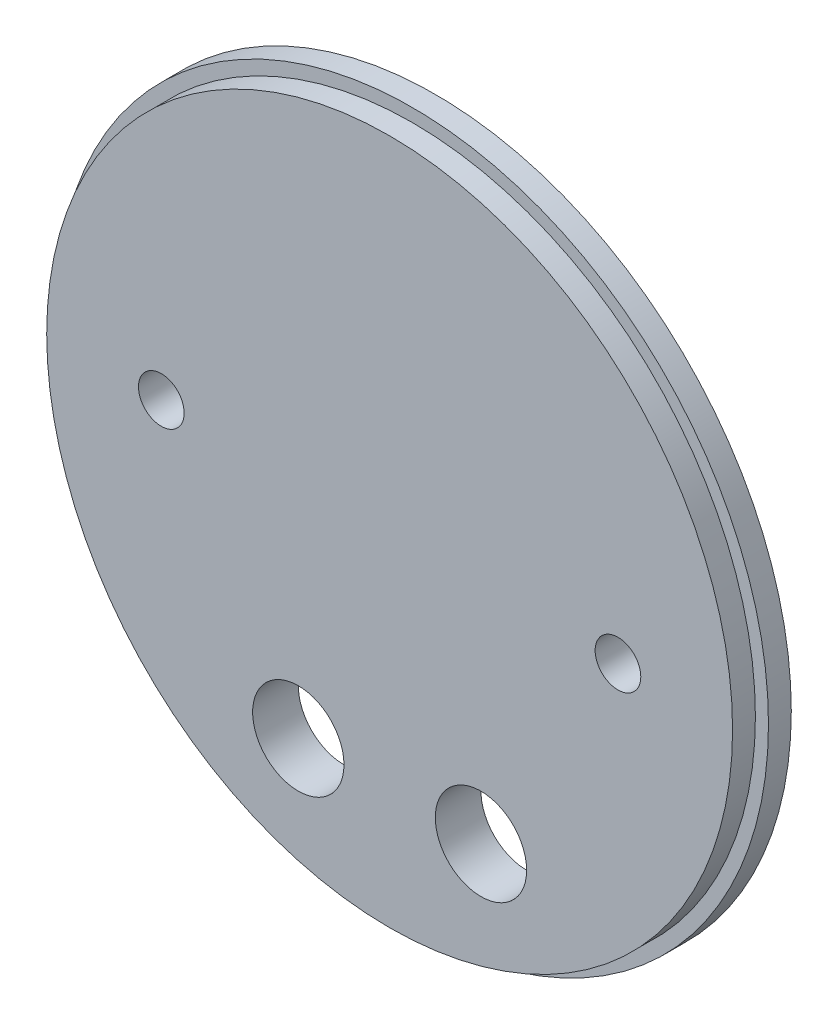
ISO-10303-21;
HEADER;
FILE_DESCRIPTION(('STEP AP214'),'2;1');
FILE_NAME('part.step','',(''),(''),'','','');
FILE_SCHEMA(('AUTOMOTIVE_DESIGN { 1 0 10303 214 1 1 1 1 }'));
ENDSEC;
DATA;
#1=APPLICATION_CONTEXT('core data for automotive mechanical design processes');
#2=APPLICATION_PROTOCOL_DEFINITION('international standard','automotive_design',2000,#1);
#3=PRODUCT_CONTEXT('',#1,'mechanical');
#4=PRODUCT('Part','Part','',(#3));
#5=PRODUCT_RELATED_PRODUCT_CATEGORY('part','',(#4));
#6=PRODUCT_DEFINITION_FORMATION('','',#4);
#7=PRODUCT_DEFINITION_CONTEXT('part definition',#1,'design');
#8=PRODUCT_DEFINITION('design','',#6,#7);
#9=PRODUCT_DEFINITION_SHAPE('','',#8);
#10=(LENGTH_UNIT() NAMED_UNIT(*) SI_UNIT(.MILLI.,.METRE.));
#11=(NAMED_UNIT(*) PLANE_ANGLE_UNIT() SI_UNIT($,.RADIAN.));
#12=(NAMED_UNIT(*) SI_UNIT($,.STERADIAN.) SOLID_ANGLE_UNIT());
#13=UNCERTAINTY_MEASURE_WITH_UNIT(LENGTH_MEASURE(1.E-05),#10,'distance_accuracy_value','');
#14=(GEOMETRIC_REPRESENTATION_CONTEXT(3) GLOBAL_UNCERTAINTY_ASSIGNED_CONTEXT((#13)) GLOBAL_UNIT_ASSIGNED_CONTEXT((#10,
#11,#12)) REPRESENTATION_CONTEXT('',''));
#15=CARTESIAN_POINT('',(0.,0.,0.));
#16=DIRECTION('',(0.,0.,1.));
#17=DIRECTION('',(1.,0.,0.));
#18=AXIS2_PLACEMENT_3D('',#15,#16,#17);
#19=CARTESIAN_POINT('',(0.,0.,3.175));
#20=DIRECTION('',(0.,0.,-1.));
#21=DIRECTION('',(-1.,0.,0.));
#22=AXIS2_PLACEMENT_3D('',#19,#20,#21);
#23=CYLINDRICAL_SURFACE('',#22,49.5046);
#24=CARTESIAN_POINT('',(0.,0.,3.175));
#25=DIRECTION('',(0.,0.,1.));
#26=DIRECTION('',(1.,0.,0.));
#27=AXIS2_PLACEMENT_3D('',#24,#25,#26);
#28=CIRCLE('',#27,49.5046);
#29=CARTESIAN_POINT('',(49.5046,0.,3.175));
#30=VERTEX_POINT('',#29);
#31=EDGE_CURVE('E40',#30,#30,#28,.T.);
#32=ORIENTED_EDGE('',*,*,#31,.F.);
#33=EDGE_LOOP('',(#32));
#34=FACE_BOUND('',#33,.T.);
#35=CARTESIAN_POINT('',(0.,0.,0.));
#36=DIRECTION('',(0.,0.,1.));
#37=DIRECTION('',(1.,0.,0.));
#38=AXIS2_PLACEMENT_3D('',#35,#36,#37);
#39=CIRCLE('',#38,49.5046);
#40=CARTESIAN_POINT('',(49.5046,0.,0.));
#41=VERTEX_POINT('',#40);
#42=EDGE_CURVE('E36',#41,#41,#39,.T.);
#43=ORIENTED_EDGE('',*,*,#42,.T.);
#44=EDGE_LOOP('',(#43));
#45=FACE_BOUND('',#44,.T.);
#46=ADVANCED_FACE('F33',(#34,#45),#23,.T.);
#47=CARTESIAN_POINT('',(0.,0.,3.175));
#48=DIRECTION('',(0.,0.,1.));
#49=DIRECTION('',(1.,0.,0.));
#50=AXIS2_PLACEMENT_3D('',#47,#48,#49);
#51=PLANE('',#50);
#52=CARTESIAN_POINT('',(0.,0.,3.175));
#53=DIRECTION('',(0.,0.,1.));
#54=DIRECTION('',(1.,0.,0.));
#55=AXIS2_PLACEMENT_3D('',#52,#53,#54);
#56=CIRCLE('',#55,47.6885);
#57=CARTESIAN_POINT('',(47.6885,0.,3.175));
#58=VERTEX_POINT('',#57);
#59=EDGE_CURVE('E10',#58,#58,#56,.T.);
#60=ORIENTED_EDGE('',*,*,#59,.F.);
#61=EDGE_LOOP('',(#60));
#62=FACE_BOUND('',#61,.T.);
#63=ORIENTED_EDGE('',*,*,#31,.T.);
#64=EDGE_LOOP('',(#63));
#65=FACE_BOUND('',#64,.T.);
#66=ADVANCED_FACE('F100',(#62,#65),#51,.T.);
#67=CARTESIAN_POINT('',(0.,0.,0.));
#68=DIRECTION('',(0.,0.,1.));
#69=DIRECTION('',(1.,0.,0.));
#70=AXIS2_PLACEMENT_3D('',#67,#68,#69);
#71=PLANE('',#70);
#72=CARTESIAN_POINT('',(31.75,0.,0.));
#73=DIRECTION('',(0.,0.,1.));
#74=DIRECTION('',(1.,0.,0.));
#75=AXIS2_PLACEMENT_3D('',#72,#73,#74);
#76=CIRCLE('',#75,3.175);
#77=CARTESIAN_POINT('',(34.925,0.,0.));
#78=VERTEX_POINT('',#77);
#79=EDGE_CURVE('E59',#78,#78,#76,.T.);
#80=ORIENTED_EDGE('',*,*,#79,.T.);
#81=EDGE_LOOP('',(#80));
#82=FACE_BOUND('',#81,.T.);
#83=CARTESIAN_POINT('',(-31.75,0.,0.));
#84=DIRECTION('',(0.,0.,1.));
#85=DIRECTION('',(1.,0.,0.));
#86=AXIS2_PLACEMENT_3D('',#83,#84,#85);
#87=CIRCLE('',#86,3.175);
#88=CARTESIAN_POINT('',(-28.575,0.,0.));
#89=VERTEX_POINT('',#88);
#90=EDGE_CURVE('E65',#89,#89,#87,.T.);
#91=ORIENTED_EDGE('',*,*,#90,.T.);
#92=EDGE_LOOP('',(#91));
#93=FACE_BOUND('',#92,.T.);
#94=CARTESIAN_POINT('',(12.7,-31.2353524431853,0.));
#95=DIRECTION('',(0.,0.,1.));
#96=DIRECTION('',(1.,0.,0.));
#97=AXIS2_PLACEMENT_3D('',#94,#95,#96);
#98=CIRCLE('',#97,6.35);
#99=CARTESIAN_POINT('',(19.05,-31.2353524431853,0.));
#100=VERTEX_POINT('',#99);
#101=EDGE_CURVE('E53',#100,#100,#98,.T.);
#102=ORIENTED_EDGE('',*,*,#101,.T.);
#103=EDGE_LOOP('',(#102));
#104=FACE_BOUND('',#103,.T.);
#105=CARTESIAN_POINT('',(-12.7,-31.2353524431853,0.));
#106=DIRECTION('',(0.,0.,1.));
#107=DIRECTION('',(1.,0.,0.));
#108=AXIS2_PLACEMENT_3D('',#105,#106,#107);
#109=CIRCLE('',#108,6.35);
#110=CARTESIAN_POINT('',(-6.35,-31.2353524431853,0.));
#111=VERTEX_POINT('',#110);
#112=EDGE_CURVE('E49',#111,#111,#109,.T.);
#113=ORIENTED_EDGE('',*,*,#112,.T.);
#114=EDGE_LOOP('',(#113));
#115=FACE_BOUND('',#114,.T.);
#116=ORIENTED_EDGE('',*,*,#42,.F.);
#117=EDGE_LOOP('',(#116));
#118=FACE_BOUND('',#117,.T.);
#119=ADVANCED_FACE('F74',(#82,#93,#104,#115,#118),#71,.F.);
#120=CARTESIAN_POINT('',(0.,0.,6.35));
#121=DIRECTION('',(0.,0.,-1.));
#122=DIRECTION('',(-1.,0.,0.));
#123=AXIS2_PLACEMENT_3D('',#120,#121,#122);
#124=CYLINDRICAL_SURFACE('',#123,47.6885);
#125=CARTESIAN_POINT('',(0.,0.,6.35));
#126=DIRECTION('',(0.,0.,1.));
#127=DIRECTION('',(1.,0.,0.));
#128=AXIS2_PLACEMENT_3D('',#125,#126,#127);
#129=CIRCLE('',#128,47.6885);
#130=CARTESIAN_POINT('',(47.6885,0.,6.35));
#131=VERTEX_POINT('',#130);
#132=EDGE_CURVE('E46',#131,#131,#129,.T.);
#133=ORIENTED_EDGE('',*,*,#132,.F.);
#134=EDGE_LOOP('',(#133));
#135=FACE_BOUND('',#134,.T.);
#136=ORIENTED_EDGE('',*,*,#59,.T.);
#137=EDGE_LOOP('',(#136));
#138=FACE_BOUND('',#137,.T.);
#139=ADVANCED_FACE('F88',(#135,#138),#124,.T.);
#140=CARTESIAN_POINT('',(0.,0.,6.35));
#141=DIRECTION('',(0.,0.,1.));
#142=DIRECTION('',(1.,0.,0.));
#143=AXIS2_PLACEMENT_3D('',#140,#141,#142);
#144=PLANE('',#143);
#145=CARTESIAN_POINT('',(31.75,0.,6.35));
#146=DIRECTION('',(0.,0.,1.));
#147=DIRECTION('',(1.,0.,0.));
#148=AXIS2_PLACEMENT_3D('',#145,#146,#147);
#149=CIRCLE('',#148,3.175);
#150=CARTESIAN_POINT('',(34.925,0.,6.35));
#151=VERTEX_POINT('',#150);
#152=EDGE_CURVE('E56',#151,#151,#149,.T.);
#153=ORIENTED_EDGE('',*,*,#152,.F.);
#154=EDGE_LOOP('',(#153));
#155=FACE_BOUND('',#154,.T.);
#156=CARTESIAN_POINT('',(-31.75,0.,6.35));
#157=DIRECTION('',(0.,0.,1.));
#158=DIRECTION('',(1.,0.,0.));
#159=AXIS2_PLACEMENT_3D('',#156,#157,#158);
#160=CIRCLE('',#159,3.175);
#161=CARTESIAN_POINT('',(-28.575,0.,6.35));
#162=VERTEX_POINT('',#161);
#163=EDGE_CURVE('E62',#162,#162,#160,.T.);
#164=ORIENTED_EDGE('',*,*,#163,.F.);
#165=EDGE_LOOP('',(#164));
#166=FACE_BOUND('',#165,.T.);
#167=CARTESIAN_POINT('',(12.7,-31.2353524431853,6.35));
#168=DIRECTION('',(0.,0.,1.));
#169=DIRECTION('',(1.,0.,0.));
#170=AXIS2_PLACEMENT_3D('',#167,#168,#169);
#171=CIRCLE('',#170,6.35);
#172=CARTESIAN_POINT('',(19.05,-31.2353524431853,6.35));
#173=VERTEX_POINT('',#172);
#174=EDGE_CURVE('E68',#173,#173,#171,.T.);
#175=ORIENTED_EDGE('',*,*,#174,.F.);
#176=EDGE_LOOP('',(#175));
#177=FACE_BOUND('',#176,.T.);
#178=CARTESIAN_POINT('',(-12.7,-31.2353524431853,6.35));
#179=DIRECTION('',(0.,0.,1.));
#180=DIRECTION('',(1.,0.,0.));
#181=AXIS2_PLACEMENT_3D('',#178,#179,#180);
#182=CIRCLE('',#181,6.35);
#183=CARTESIAN_POINT('',(-6.35,-31.2353524431853,6.35));
#184=VERTEX_POINT('',#183);
#185=EDGE_CURVE('E50',#184,#184,#182,.T.);
#186=ORIENTED_EDGE('',*,*,#185,.F.);
#187=EDGE_LOOP('',(#186));
#188=FACE_BOUND('',#187,.T.);
#189=ORIENTED_EDGE('',*,*,#132,.T.);
#190=EDGE_LOOP('',(#189));
#191=FACE_BOUND('',#190,.T.);
#192=ADVANCED_FACE('F85',(#155,#166,#177,#188,#191),#144,.T.);
#193=CARTESIAN_POINT('',(-12.7,-31.2353524431853,0.));
#194=DIRECTION('',(0.,0.,1.));
#195=DIRECTION('',(1.,0.,0.));
#196=AXIS2_PLACEMENT_3D('',#193,#194,#195);
#197=CYLINDRICAL_SURFACE('',#196,6.35);
#198=ORIENTED_EDGE('',*,*,#112,.F.);
#199=EDGE_LOOP('',(#198));
#200=FACE_BOUND('',#199,.T.);
#201=ORIENTED_EDGE('',*,*,#185,.T.);
#202=EDGE_LOOP('',(#201));
#203=FACE_BOUND('',#202,.T.);
#204=ADVANCED_FACE('F81',(#200,#203),#197,.F.);
#205=CARTESIAN_POINT('',(12.7,-31.2353524431853,0.));
#206=DIRECTION('',(0.,0.,1.));
#207=DIRECTION('',(1.,0.,0.));
#208=AXIS2_PLACEMENT_3D('',#205,#206,#207);
#209=CYLINDRICAL_SURFACE('',#208,6.35);
#210=ORIENTED_EDGE('',*,*,#101,.F.);
#211=EDGE_LOOP('',(#210));
#212=FACE_BOUND('',#211,.T.);
#213=ORIENTED_EDGE('',*,*,#174,.T.);
#214=EDGE_LOOP('',(#213));
#215=FACE_BOUND('',#214,.T.);
#216=ADVANCED_FACE('F77',(#212,#215),#209,.F.);
#217=CARTESIAN_POINT('',(-31.75,0.,0.));
#218=DIRECTION('',(0.,0.,1.));
#219=DIRECTION('',(1.,0.,0.));
#220=AXIS2_PLACEMENT_3D('',#217,#218,#219);
#221=CYLINDRICAL_SURFACE('',#220,3.175);
#222=ORIENTED_EDGE('',*,*,#90,.F.);
#223=EDGE_LOOP('',(#222));
#224=FACE_BOUND('',#223,.T.);
#225=ORIENTED_EDGE('',*,*,#163,.T.);
#226=EDGE_LOOP('',(#225));
#227=FACE_BOUND('',#226,.T.);
#228=ADVANCED_FACE('F80',(#224,#227),#221,.F.);
#229=CARTESIAN_POINT('',(31.75,0.,0.));
#230=DIRECTION('',(0.,0.,1.));
#231=DIRECTION('',(1.,0.,0.));
#232=AXIS2_PLACEMENT_3D('',#229,#230,#231);
#233=CYLINDRICAL_SURFACE('',#232,3.175);
#234=ORIENTED_EDGE('',*,*,#79,.F.);
#235=EDGE_LOOP('',(#234));
#236=FACE_BOUND('',#235,.T.);
#237=ORIENTED_EDGE('',*,*,#152,.T.);
#238=EDGE_LOOP('',(#237));
#239=FACE_BOUND('',#238,.T.);
#240=ADVANCED_FACE('F153',(#236,#239),#233,.F.);
#241=CLOSED_SHELL('',(#46,#66,#119,#139,#192,#204,#216,#228,#240));
#242=MANIFOLD_SOLID_BREP('B2',#241);
#243=ADVANCED_BREP_SHAPE_REPRESENTATION('',(#18,#242),#14);
#244=SHAPE_DEFINITION_REPRESENTATION(#9,#243);
ENDSEC;
END-ISO-10303-21;
